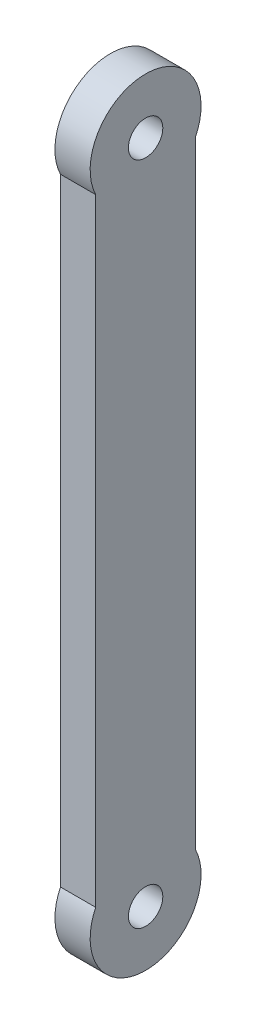
ISO-10303-21;
HEADER;
FILE_DESCRIPTION(('STEP AP214'),'2;1');
FILE_NAME('part.step','',(''),(''),'','','');
FILE_SCHEMA(('AUTOMOTIVE_DESIGN { 1 0 10303 214 1 1 1 1 }'));
ENDSEC;
DATA;
#1=APPLICATION_CONTEXT('core data for automotive mechanical design processes');
#2=APPLICATION_PROTOCOL_DEFINITION('international standard','automotive_design',2000,#1);
#3=PRODUCT_CONTEXT('',#1,'mechanical');
#4=PRODUCT('Part','Part','',(#3));
#5=PRODUCT_RELATED_PRODUCT_CATEGORY('part','',(#4));
#6=PRODUCT_DEFINITION_FORMATION('','',#4);
#7=PRODUCT_DEFINITION_CONTEXT('part definition',#1,'design');
#8=PRODUCT_DEFINITION('design','',#6,#7);
#9=PRODUCT_DEFINITION_SHAPE('','',#8);
#10=(LENGTH_UNIT() NAMED_UNIT(*) SI_UNIT(.MILLI.,.METRE.));
#11=(NAMED_UNIT(*) PLANE_ANGLE_UNIT() SI_UNIT($,.RADIAN.));
#12=(NAMED_UNIT(*) SI_UNIT($,.STERADIAN.) SOLID_ANGLE_UNIT());
#13=UNCERTAINTY_MEASURE_WITH_UNIT(LENGTH_MEASURE(1.E-05),#10,'distance_accuracy_value','');
#14=(GEOMETRIC_REPRESENTATION_CONTEXT(3) GLOBAL_UNCERTAINTY_ASSIGNED_CONTEXT((#13)) GLOBAL_UNIT_ASSIGNED_CONTEXT((#10,
#11,#12)) REPRESENTATION_CONTEXT('',''));
#15=CARTESIAN_POINT('',(0.,0.,0.));
#16=DIRECTION('',(0.,0.,1.));
#17=DIRECTION('',(1.,0.,0.));
#18=AXIS2_PLACEMENT_3D('',#15,#16,#17);
#19=CARTESIAN_POINT('',(3.175,-60.,0.));
#20=DIRECTION('',(1.,0.,0.));
#21=DIRECTION('',(0.,0.,-1.));
#22=AXIS2_PLACEMENT_3D('',#19,#20,#21);
#23=PLANE('',#22);
#24=CARTESIAN_POINT('',(3.175,0.,0.));
#25=DIRECTION('',(1.,0.,0.));
#26=DIRECTION('',(0.,0.,-1.));
#27=AXIS2_PLACEMENT_3D('',#24,#25,#26);
#28=CIRCLE('',#27,1.55);
#29=CARTESIAN_POINT('',(3.175,0.,-1.55));
#30=VERTEX_POINT('',#29);
#31=EDGE_CURVE('E100',#30,#30,#28,.T.);
#32=ORIENTED_EDGE('',*,*,#31,.F.);
#33=EDGE_LOOP('',(#32));
#34=FACE_BOUND('',#33,.T.);
#35=CARTESIAN_POINT('',(3.175,-60.,0.));
#36=DIRECTION('',(1.,0.,0.));
#37=DIRECTION('',(0.,0.,-1.));
#38=AXIS2_PLACEMENT_3D('',#35,#36,#37);
#39=CIRCLE('',#38,5.);
#40=CARTESIAN_POINT('',(3.175,-57.8205505282297,4.50000000000001));
#41=VERTEX_POINT('',#40);
#42=CARTESIAN_POINT('',(3.175,-57.8205505282297,-4.50000000000001));
#43=VERTEX_POINT('',#42);
#44=EDGE_CURVE('E85',#41,#43,#39,.T.);
#45=ORIENTED_EDGE('',*,*,#44,.T.);
#46=DIRECTION('',(0.,1.,0.));
#47=VECTOR('',#46,1.);
#48=CARTESIAN_POINT('',(3.175,-2.17944947177034,-4.5));
#49=LINE('',#48,#47);
#50=CARTESIAN_POINT('',(3.175,-2.17944947177034,-4.5));
#51=VERTEX_POINT('',#50);
#52=EDGE_CURVE('E80',#43,#51,#49,.T.);
#53=ORIENTED_EDGE('',*,*,#52,.T.);
#54=CARTESIAN_POINT('',(3.175,0.,0.));
#55=DIRECTION('',(1.,0.,0.));
#56=DIRECTION('',(0.,0.,-1.));
#57=AXIS2_PLACEMENT_3D('',#54,#55,#56);
#58=CIRCLE('',#57,5.);
#59=CARTESIAN_POINT('',(3.175,-2.17944947177034,4.5));
#60=VERTEX_POINT('',#59);
#61=EDGE_CURVE('E83',#51,#60,#58,.T.);
#62=ORIENTED_EDGE('',*,*,#61,.T.);
#63=DIRECTION('',(0.,-1.,0.));
#64=VECTOR('',#63,1.);
#65=CARTESIAN_POINT('',(3.175,-2.17944947177034,4.5));
#66=LINE('',#65,#64);
#67=EDGE_CURVE('E50',#60,#41,#66,.T.);
#68=ORIENTED_EDGE('',*,*,#67,.T.);
#69=EDGE_LOOP('',(#45,#53,#62,#68));
#70=FACE_BOUND('',#69,.T.);
#71=CARTESIAN_POINT('',(3.175,-60.,0.));
#72=DIRECTION('',(1.,0.,0.));
#73=DIRECTION('',(0.,0.,-1.));
#74=AXIS2_PLACEMENT_3D('',#71,#72,#73);
#75=CIRCLE('',#74,1.55000000000003);
#76=CARTESIAN_POINT('',(3.175,-60.,-1.55000000000003));
#77=VERTEX_POINT('',#76);
#78=EDGE_CURVE('E115',#77,#77,#75,.T.);
#79=ORIENTED_EDGE('',*,*,#78,.F.);
#80=EDGE_LOOP('',(#79));
#81=FACE_BOUND('',#80,.T.);
#82=ADVANCED_FACE('F33',(#34,#70,#81),#23,.T.);
#83=CARTESIAN_POINT('',(0.,-60.,0.));
#84=DIRECTION('',(1.,0.,0.));
#85=DIRECTION('',(0.,0.,-1.));
#86=AXIS2_PLACEMENT_3D('',#83,#84,#85);
#87=PLANE('',#86);
#88=CARTESIAN_POINT('',(0.,-60.,0.));
#89=DIRECTION('',(1.,0.,0.));
#90=DIRECTION('',(0.,0.,-1.));
#91=AXIS2_PLACEMENT_3D('',#88,#89,#90);
#92=CIRCLE('',#91,5.);
#93=CARTESIAN_POINT('',(0.,-57.8205505282297,4.50000000000001));
#94=VERTEX_POINT('',#93);
#95=CARTESIAN_POINT('',(0.,-57.8205505282297,-4.50000000000001));
#96=VERTEX_POINT('',#95);
#97=EDGE_CURVE('E97',#94,#96,#92,.T.);
#98=ORIENTED_EDGE('',*,*,#97,.F.);
#99=DIRECTION('',(0.,-1.,0.));
#100=VECTOR('',#99,1.);
#101=CARTESIAN_POINT('',(0.,-2.17944947177034,4.5));
#102=LINE('',#101,#100);
#103=CARTESIAN_POINT('',(0.,-2.17944947177034,4.5));
#104=VERTEX_POINT('',#103);
#105=EDGE_CURVE('E73',#104,#94,#102,.T.);
#106=ORIENTED_EDGE('',*,*,#105,.F.);
#107=CARTESIAN_POINT('',(0.,0.,0.));
#108=DIRECTION('',(1.,0.,0.));
#109=DIRECTION('',(0.,0.,-1.));
#110=AXIS2_PLACEMENT_3D('',#107,#108,#109);
#111=CIRCLE('',#110,5.);
#112=CARTESIAN_POINT('',(0.,-2.17944947177034,-4.5));
#113=VERTEX_POINT('',#112);
#114=EDGE_CURVE('E67',#113,#104,#111,.T.);
#115=ORIENTED_EDGE('',*,*,#114,.F.);
#116=DIRECTION('',(0.,1.,0.));
#117=VECTOR('',#116,1.);
#118=CARTESIAN_POINT('',(0.,-2.17944947177034,-4.5));
#119=LINE('',#118,#117);
#120=EDGE_CURVE('E89',#96,#113,#119,.T.);
#121=ORIENTED_EDGE('',*,*,#120,.F.);
#122=EDGE_LOOP('',(#98,#106,#115,#121));
#123=FACE_BOUND('',#122,.T.);
#124=CARTESIAN_POINT('',(0.,0.,0.));
#125=DIRECTION('',(1.,0.,0.));
#126=DIRECTION('',(0.,0.,-1.));
#127=AXIS2_PLACEMENT_3D('',#124,#125,#126);
#128=CIRCLE('',#127,1.55);
#129=CARTESIAN_POINT('',(0.,0.,-1.55));
#130=VERTEX_POINT('',#129);
#131=EDGE_CURVE('E112',#130,#130,#128,.T.);
#132=ORIENTED_EDGE('',*,*,#131,.T.);
#133=EDGE_LOOP('',(#132));
#134=FACE_BOUND('',#133,.T.);
#135=CARTESIAN_POINT('',(0.,-60.,0.));
#136=DIRECTION('',(1.,0.,0.));
#137=DIRECTION('',(0.,0.,-1.));
#138=AXIS2_PLACEMENT_3D('',#135,#136,#137);
#139=CIRCLE('',#138,1.55000000000003);
#140=CARTESIAN_POINT('',(0.,-60.,-1.55000000000003));
#141=VERTEX_POINT('',#140);
#142=EDGE_CURVE('E118',#141,#141,#139,.T.);
#143=ORIENTED_EDGE('',*,*,#142,.T.);
#144=EDGE_LOOP('',(#143));
#145=FACE_BOUND('',#144,.T.);
#146=ADVANCED_FACE('F108',(#123,#134,#145),#87,.F.);
#147=CARTESIAN_POINT('',(3.175,-60.,0.));
#148=DIRECTION('',(-1.,0.,0.));
#149=DIRECTION('',(0.,0.,1.));
#150=AXIS2_PLACEMENT_3D('',#147,#148,#149);
#151=CYLINDRICAL_SURFACE('',#150,5.);
#152=ORIENTED_EDGE('',*,*,#97,.T.);
#153=DIRECTION('',(-1.,0.,0.));
#154=VECTOR('',#153,1.);
#155=CARTESIAN_POINT('',(3.175,-57.8205505282297,-4.50000000000001));
#156=LINE('',#155,#154);
#157=EDGE_CURVE('E11',#43,#96,#156,.T.);
#158=ORIENTED_EDGE('',*,*,#157,.F.);
#159=ORIENTED_EDGE('',*,*,#44,.F.);
#160=DIRECTION('',(-1.,0.,0.));
#161=VECTOR('',#160,1.);
#162=CARTESIAN_POINT('',(3.175,-57.8205505282297,4.50000000000001));
#163=LINE('',#162,#161);
#164=EDGE_CURVE('E93',#41,#94,#163,.T.);
#165=ORIENTED_EDGE('',*,*,#164,.T.);
#166=EDGE_LOOP('',(#152,#158,#159,#165));
#167=FACE_BOUND('',#166,.T.);
#168=ADVANCED_FACE('F35',(#167),#151,.T.);
#169=CARTESIAN_POINT('',(3.175,-2.17944947177034,-4.5));
#170=DIRECTION('',(0.,0.,1.));
#171=DIRECTION('',(0.,-1.,0.));
#172=AXIS2_PLACEMENT_3D('',#169,#170,#171);
#173=PLANE('',#172);
#174=ORIENTED_EDGE('',*,*,#120,.T.);
#175=DIRECTION('',(-1.,0.,0.));
#176=VECTOR('',#175,1.);
#177=CARTESIAN_POINT('',(3.175,-2.17944947177034,-4.5));
#178=LINE('',#177,#176);
#179=EDGE_CURVE('E42',#51,#113,#178,.T.);
#180=ORIENTED_EDGE('',*,*,#179,.F.);
#181=ORIENTED_EDGE('',*,*,#52,.F.);
#182=ORIENTED_EDGE('',*,*,#157,.T.);
#183=EDGE_LOOP('',(#174,#180,#181,#182));
#184=FACE_BOUND('',#183,.T.);
#185=ADVANCED_FACE('F88',(#184),#173,.F.);
#186=CARTESIAN_POINT('',(3.175,0.,0.));
#187=DIRECTION('',(-1.,0.,0.));
#188=DIRECTION('',(0.,0.,1.));
#189=AXIS2_PLACEMENT_3D('',#186,#187,#188);
#190=CYLINDRICAL_SURFACE('',#189,5.);
#191=ORIENTED_EDGE('',*,*,#114,.T.);
#192=DIRECTION('',(-1.,0.,0.));
#193=VECTOR('',#192,1.);
#194=CARTESIAN_POINT('',(3.175,-2.17944947177034,4.5));
#195=LINE('',#194,#193);
#196=EDGE_CURVE('E90',#60,#104,#195,.T.);
#197=ORIENTED_EDGE('',*,*,#196,.F.);
#198=ORIENTED_EDGE('',*,*,#61,.F.);
#199=ORIENTED_EDGE('',*,*,#179,.T.);
#200=EDGE_LOOP('',(#191,#197,#198,#199));
#201=FACE_BOUND('',#200,.T.);
#202=ADVANCED_FACE('F91',(#201),#190,.T.);
#203=CARTESIAN_POINT('',(3.175,-2.17944947177034,4.5));
#204=DIRECTION('',(0.,0.,-1.));
#205=DIRECTION('',(0.,1.,0.));
#206=AXIS2_PLACEMENT_3D('',#203,#204,#205);
#207=PLANE('',#206);
#208=ORIENTED_EDGE('',*,*,#105,.T.);
#209=ORIENTED_EDGE('',*,*,#164,.F.);
#210=ORIENTED_EDGE('',*,*,#67,.F.);
#211=ORIENTED_EDGE('',*,*,#196,.T.);
#212=EDGE_LOOP('',(#208,#209,#210,#211));
#213=FACE_BOUND('',#212,.T.);
#214=ADVANCED_FACE('F105',(#213),#207,.F.);
#215=CARTESIAN_POINT('',(3.175,0.,0.));
#216=DIRECTION('',(-1.,0.,0.));
#217=DIRECTION('',(0.,0.,1.));
#218=AXIS2_PLACEMENT_3D('',#215,#216,#217);
#219=CYLINDRICAL_SURFACE('',#218,1.55);
#220=ORIENTED_EDGE('',*,*,#31,.T.);
#221=EDGE_LOOP('',(#220));
#222=FACE_BOUND('',#221,.T.);
#223=ORIENTED_EDGE('',*,*,#131,.F.);
#224=EDGE_LOOP('',(#223));
#225=FACE_BOUND('',#224,.T.);
#226=ADVANCED_FACE('F135',(#222,#225),#219,.F.);
#227=CARTESIAN_POINT('',(3.175,-60.,0.));
#228=DIRECTION('',(-1.,0.,0.));
#229=DIRECTION('',(0.,0.,1.));
#230=AXIS2_PLACEMENT_3D('',#227,#228,#229);
#231=CYLINDRICAL_SURFACE('',#230,1.55000000000003);
#232=ORIENTED_EDGE('',*,*,#78,.T.);
#233=EDGE_LOOP('',(#232));
#234=FACE_BOUND('',#233,.T.);
#235=ORIENTED_EDGE('',*,*,#142,.F.);
#236=EDGE_LOOP('',(#235));
#237=FACE_BOUND('',#236,.T.);
#238=ADVANCED_FACE('F124',(#234,#237),#231,.F.);
#239=CLOSED_SHELL('',(#82,#146,#168,#185,#202,#214,#226,#238));
#240=MANIFOLD_SOLID_BREP('B2',#239);
#241=ADVANCED_BREP_SHAPE_REPRESENTATION('',(#18,#240),#14);
#242=SHAPE_DEFINITION_REPRESENTATION(#9,#241);
ENDSEC;
END-ISO-10303-21;
